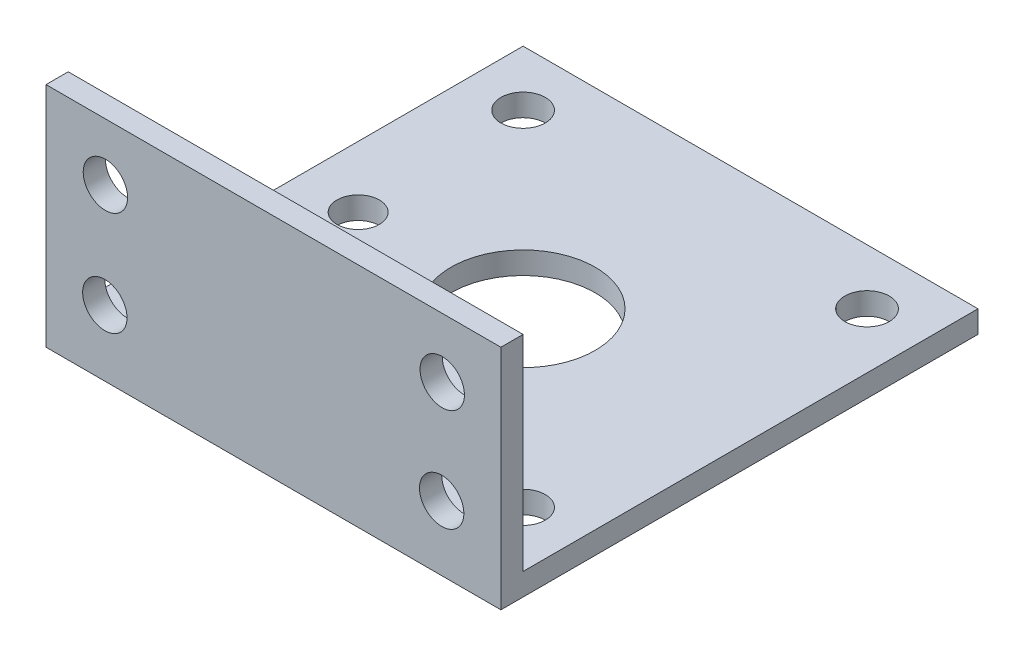
ISO-10303-21;
HEADER;
FILE_DESCRIPTION(('STEP AP214'),'2;1');
FILE_NAME('part.step','',(''),(''),'','','');
FILE_SCHEMA(('AUTOMOTIVE_DESIGN { 1 0 10303 214 1 1 1 1 }'));
ENDSEC;
DATA;
#1=APPLICATION_CONTEXT('core data for automotive mechanical design processes');
#2=APPLICATION_PROTOCOL_DEFINITION('international standard','automotive_design',2000,#1);
#3=PRODUCT_CONTEXT('',#1,'mechanical');
#4=PRODUCT('Part','Part','',(#3));
#5=PRODUCT_RELATED_PRODUCT_CATEGORY('part','',(#4));
#6=PRODUCT_DEFINITION_FORMATION('','',#4);
#7=PRODUCT_DEFINITION_CONTEXT('part definition',#1,'design');
#8=PRODUCT_DEFINITION('design','',#6,#7);
#9=PRODUCT_DEFINITION_SHAPE('','',#8);
#10=(LENGTH_UNIT() NAMED_UNIT(*) SI_UNIT(.MILLI.,.METRE.));
#11=(NAMED_UNIT(*) PLANE_ANGLE_UNIT() SI_UNIT($,.RADIAN.));
#12=(NAMED_UNIT(*) SI_UNIT($,.STERADIAN.) SOLID_ANGLE_UNIT());
#13=UNCERTAINTY_MEASURE_WITH_UNIT(LENGTH_MEASURE(1.E-05),#10,'distance_accuracy_value','');
#14=(GEOMETRIC_REPRESENTATION_CONTEXT(3) GLOBAL_UNCERTAINTY_ASSIGNED_CONTEXT((#13)) GLOBAL_UNIT_ASSIGNED_CONTEXT((#10,
#11,#12)) REPRESENTATION_CONTEXT('',''));
#15=CARTESIAN_POINT('',(0.,0.,0.));
#16=DIRECTION('',(0.,0.,1.));
#17=DIRECTION('',(1.,0.,0.));
#18=AXIS2_PLACEMENT_3D('',#15,#16,#17);
#19=CARTESIAN_POINT('',(0.,0.,22.5));
#20=DIRECTION('',(0.,0.,1.));
#21=DIRECTION('',(1.,0.,0.));
#22=AXIS2_PLACEMENT_3D('',#19,#20,#21);
#23=PLANE('',#22);
#24=CARTESIAN_POINT('',(15.2109088754108,15.1307672317759,22.5));
#25=DIRECTION('',(0.,0.,1.));
#26=DIRECTION('',(1.,0.,0.));
#27=AXIS2_PLACEMENT_3D('',#24,#25,#26);
#28=CIRCLE('',#27,2.);
#29=CARTESIAN_POINT('',(17.2109088754108,15.1307672317759,22.5));
#30=VERTEX_POINT('',#29);
#31=EDGE_CURVE('E224',#30,#30,#28,.F.);
#32=ORIENTED_EDGE('',*,*,#31,.T.);
#33=EDGE_LOOP('',(#32));
#34=FACE_BOUND('',#33,.T.);
#35=CARTESIAN_POINT('',(-15.1464761819282,15.3531982960748,22.5));
#36=DIRECTION('',(0.,0.,1.));
#37=DIRECTION('',(1.,0.,0.));
#38=AXIS2_PLACEMENT_3D('',#35,#36,#37);
#39=CIRCLE('',#38,2.);
#40=CARTESIAN_POINT('',(-13.1464761819282,15.3531982960748,22.5));
#41=VERTEX_POINT('',#40);
#42=EDGE_CURVE('E226',#41,#41,#39,.T.);
#43=ORIENTED_EDGE('',*,*,#42,.F.);
#44=EDGE_LOOP('',(#43));
#45=FACE_BOUND('',#44,.T.);
#46=CARTESIAN_POINT('',(15.1615117112667,5.8441003726651,22.5));
#47=DIRECTION('',(0.,0.,1.));
#48=DIRECTION('',(1.,0.,0.));
#49=AXIS2_PLACEMENT_3D('',#46,#47,#48);
#50=CIRCLE('',#49,2.);
#51=CARTESIAN_POINT('',(17.1615117112667,5.8441003726651,22.5));
#52=VERTEX_POINT('',#51);
#53=EDGE_CURVE('E229',#52,#52,#50,.T.);
#54=ORIENTED_EDGE('',*,*,#53,.F.);
#55=EDGE_LOOP('',(#54));
#56=FACE_BOUND('',#55,.T.);
#57=DIRECTION('',(1.,0.,0.));
#58=VECTOR('',#57,1.);
#59=CARTESIAN_POINT('',(0.,0.,22.5));
#60=LINE('',#59,#58);
#61=CARTESIAN_POINT('',(-20.5,0.,22.5));
#62=VERTEX_POINT('',#61);
#63=CARTESIAN_POINT('',(20.5,0.,22.5));
#64=VERTEX_POINT('',#63);
#65=EDGE_CURVE('E135',#62,#64,#60,.T.);
#66=ORIENTED_EDGE('',*,*,#65,.T.);
#67=DIRECTION('',(0.,1.,0.));
#68=VECTOR('',#67,1.);
#69=CARTESIAN_POINT('',(20.5,0.,22.5));
#70=LINE('',#69,#68);
#71=CARTESIAN_POINT('',(20.5,20.5,22.5));
#72=VERTEX_POINT('',#71);
#73=EDGE_CURVE('E140',#64,#72,#70,.T.);
#74=ORIENTED_EDGE('',*,*,#73,.T.);
#75=DIRECTION('',(1.,0.,0.));
#76=VECTOR('',#75,1.);
#77=CARTESIAN_POINT('',(0.,20.5,22.5));
#78=LINE('',#77,#76);
#79=CARTESIAN_POINT('',(-20.5,20.5,22.5));
#80=VERTEX_POINT('',#79);
#81=EDGE_CURVE('E147',#80,#72,#78,.T.);
#82=ORIENTED_EDGE('',*,*,#81,.F.);
#83=DIRECTION('',(0.,1.,0.));
#84=VECTOR('',#83,1.);
#85=CARTESIAN_POINT('',(-20.5,0.,22.5));
#86=LINE('',#85,#84);
#87=EDGE_CURVE('E144',#62,#80,#86,.T.);
#88=ORIENTED_EDGE('',*,*,#87,.F.);
#89=EDGE_LOOP('',(#66,#74,#82,#88));
#90=FACE_BOUND('',#89,.T.);
#91=CARTESIAN_POINT('',(-15.1965217916816,5.94462366240964,22.5));
#92=DIRECTION('',(0.,0.,1.));
#93=DIRECTION('',(1.,0.,0.));
#94=AXIS2_PLACEMENT_3D('',#91,#92,#93);
#95=CIRCLE('',#94,2.);
#96=CARTESIAN_POINT('',(-13.1965217916816,5.94462366240964,22.5));
#97=VERTEX_POINT('',#96);
#98=EDGE_CURVE('E157',#97,#97,#95,.F.);
#99=ORIENTED_EDGE('',*,*,#98,.T.);
#100=EDGE_LOOP('',(#99));
#101=FACE_BOUND('',#100,.T.);
#102=ADVANCED_FACE('F35',(#34,#45,#56,#90,#101),#23,.T.);
#103=CARTESIAN_POINT('',(0.,0.,20.5));
#104=DIRECTION('',(0.,0.,1.));
#105=DIRECTION('',(1.,0.,0.));
#106=AXIS2_PLACEMENT_3D('',#103,#104,#105);
#107=PLANE('',#106);
#108=CARTESIAN_POINT('',(-15.1464761819282,15.3531982960748,20.5));
#109=DIRECTION('',(0.,0.,-1.));
#110=DIRECTION('',(-1.,0.,0.));
#111=AXIS2_PLACEMENT_3D('',#108,#109,#110);
#112=CIRCLE('',#111,2.);
#113=CARTESIAN_POINT('',(-17.1464761819282,15.3531982960748,20.5));
#114=VERTEX_POINT('',#113);
#115=EDGE_CURVE('E235',#114,#114,#112,.T.);
#116=ORIENTED_EDGE('',*,*,#115,.F.);
#117=EDGE_LOOP('',(#116));
#118=FACE_BOUND('',#117,.T.);
#119=CARTESIAN_POINT('',(15.1615117112667,5.8441003726651,20.5));
#120=DIRECTION('',(0.,0.,-1.));
#121=DIRECTION('',(-1.,0.,0.));
#122=AXIS2_PLACEMENT_3D('',#119,#120,#121);
#123=CIRCLE('',#122,2.);
#124=CARTESIAN_POINT('',(13.1615117112667,5.8441003726651,20.5));
#125=VERTEX_POINT('',#124);
#126=EDGE_CURVE('E232',#125,#125,#123,.T.);
#127=ORIENTED_EDGE('',*,*,#126,.F.);
#128=EDGE_LOOP('',(#127));
#129=FACE_BOUND('',#128,.T.);
#130=DIRECTION('',(1.,0.,0.));
#131=VECTOR('',#130,1.);
#132=CARTESIAN_POINT('',(0.,2.,20.5));
#133=LINE('',#132,#131);
#134=CARTESIAN_POINT('',(-20.5,2.,20.5));
#135=VERTEX_POINT('',#134);
#136=CARTESIAN_POINT('',(20.5,2.,20.5));
#137=VERTEX_POINT('',#136);
#138=EDGE_CURVE('E69',#135,#137,#133,.T.);
#139=ORIENTED_EDGE('',*,*,#138,.F.);
#140=DIRECTION('',(0.,1.,0.));
#141=VECTOR('',#140,1.);
#142=CARTESIAN_POINT('',(-20.5,0.,20.5));
#143=LINE('',#142,#141);
#144=CARTESIAN_POINT('',(-20.5,20.5,20.5));
#145=VERTEX_POINT('',#144);
#146=EDGE_CURVE('E141',#135,#145,#143,.T.);
#147=ORIENTED_EDGE('',*,*,#146,.T.);
#148=DIRECTION('',(1.,0.,0.));
#149=VECTOR('',#148,1.);
#150=CARTESIAN_POINT('',(0.,20.5,20.5));
#151=LINE('',#150,#149);
#152=CARTESIAN_POINT('',(20.5,20.5,20.5));
#153=VERTEX_POINT('',#152);
#154=EDGE_CURVE('E156',#145,#153,#151,.T.);
#155=ORIENTED_EDGE('',*,*,#154,.T.);
#156=DIRECTION('',(0.,1.,0.));
#157=VECTOR('',#156,1.);
#158=CARTESIAN_POINT('',(20.5,0.,20.5));
#159=LINE('',#158,#157);
#160=EDGE_CURVE('E52',#137,#153,#159,.T.);
#161=ORIENTED_EDGE('',*,*,#160,.F.);
#162=EDGE_LOOP('',(#139,#147,#155,#161));
#163=FACE_BOUND('',#162,.T.);
#164=CARTESIAN_POINT('',(15.2109088754108,15.1307672317759,20.5));
#165=DIRECTION('',(0.,0.,1.));
#166=DIRECTION('',(1.,0.,0.));
#167=AXIS2_PLACEMENT_3D('',#164,#165,#166);
#168=CIRCLE('',#167,2.);
#169=CARTESIAN_POINT('',(17.2109088754108,15.1307672317759,20.5));
#170=VERTEX_POINT('',#169);
#171=EDGE_CURVE('E239',#170,#170,#168,.T.);
#172=ORIENTED_EDGE('',*,*,#171,.T.);
#173=EDGE_LOOP('',(#172));
#174=FACE_BOUND('',#173,.T.);
#175=CARTESIAN_POINT('',(-15.1965217916816,5.94462366240964,20.5));
#176=DIRECTION('',(0.,0.,1.));
#177=DIRECTION('',(1.,0.,0.));
#178=AXIS2_PLACEMENT_3D('',#175,#176,#177);
#179=CIRCLE('',#178,2.);
#180=CARTESIAN_POINT('',(-13.1965217916816,5.94462366240964,20.5));
#181=VERTEX_POINT('',#180);
#182=EDGE_CURVE('E236',#181,#181,#179,.T.);
#183=ORIENTED_EDGE('',*,*,#182,.T.);
#184=EDGE_LOOP('',(#183));
#185=FACE_BOUND('',#184,.T.);
#186=ADVANCED_FACE('F192',(#118,#129,#163,#174,#185),#107,.F.);
#187=CARTESIAN_POINT('',(20.5,2.,0.));
#188=DIRECTION('',(1.,0.,0.));
#189=DIRECTION('',(0.,0.,-1.));
#190=AXIS2_PLACEMENT_3D('',#187,#188,#189);
#191=PLANE('',#190);
#192=DIRECTION('',(0.,0.,1.));
#193=VECTOR('',#192,1.);
#194=CARTESIAN_POINT('',(20.5,0.,0.));
#195=LINE('',#194,#193);
#196=CARTESIAN_POINT('',(20.5,0.,-20.5));
#197=VERTEX_POINT('',#196);
#198=EDGE_CURVE('E84',#197,#64,#195,.T.);
#199=ORIENTED_EDGE('',*,*,#198,.F.);
#200=DIRECTION('',(0.,-1.,0.));
#201=VECTOR('',#200,1.);
#202=CARTESIAN_POINT('',(20.5,2.,-20.5));
#203=LINE('',#202,#201);
#204=CARTESIAN_POINT('',(20.5,2.,-20.5));
#205=VERTEX_POINT('',#204);
#206=EDGE_CURVE('E11',#205,#197,#203,.T.);
#207=ORIENTED_EDGE('',*,*,#206,.F.);
#208=DIRECTION('',(0.,0.,1.));
#209=VECTOR('',#208,1.);
#210=CARTESIAN_POINT('',(20.5,2.,0.));
#211=LINE('',#210,#209);
#212=EDGE_CURVE('E81',#205,#137,#211,.T.);
#213=ORIENTED_EDGE('',*,*,#212,.T.);
#214=ORIENTED_EDGE('',*,*,#160,.T.);
#215=DIRECTION('',(0.,0.,-1.));
#216=VECTOR('',#215,1.);
#217=CARTESIAN_POINT('',(20.5,20.5,22.5));
#218=LINE('',#217,#216);
#219=EDGE_CURVE('E109',#72,#153,#218,.T.);
#220=ORIENTED_EDGE('',*,*,#219,.F.);
#221=ORIENTED_EDGE('',*,*,#73,.F.);
#222=EDGE_LOOP('',(#199,#207,#213,#214,#220,#221));
#223=FACE_BOUND('',#222,.T.);
#224=ADVANCED_FACE('F80',(#223),#191,.T.);
#225=CARTESIAN_POINT('',(0.,2.,-20.5));
#226=DIRECTION('',(0.,0.,-1.));
#227=DIRECTION('',(-1.,0.,0.));
#228=AXIS2_PLACEMENT_3D('',#225,#226,#227);
#229=PLANE('',#228);
#230=DIRECTION('',(1.,0.,0.));
#231=VECTOR('',#230,1.);
#232=CARTESIAN_POINT('',(0.,0.,-20.5));
#233=LINE('',#232,#231);
#234=CARTESIAN_POINT('',(-20.5,0.,-20.5));
#235=VERTEX_POINT('',#234);
#236=EDGE_CURVE('E119',#235,#197,#233,.T.);
#237=ORIENTED_EDGE('',*,*,#236,.F.);
#238=DIRECTION('',(0.,-1.,0.));
#239=VECTOR('',#238,1.);
#240=CARTESIAN_POINT('',(-20.5,2.,-20.5));
#241=LINE('',#240,#239);
#242=CARTESIAN_POINT('',(-20.5,2.,-20.5));
#243=VERTEX_POINT('',#242);
#244=EDGE_CURVE('E44',#243,#235,#241,.T.);
#245=ORIENTED_EDGE('',*,*,#244,.F.);
#246=DIRECTION('',(1.,0.,0.));
#247=VECTOR('',#246,1.);
#248=CARTESIAN_POINT('',(0.,2.,-20.5));
#249=LINE('',#248,#247);
#250=EDGE_CURVE('E91',#243,#205,#249,.T.);
#251=ORIENTED_EDGE('',*,*,#250,.T.);
#252=ORIENTED_EDGE('',*,*,#206,.T.);
#253=EDGE_LOOP('',(#237,#245,#251,#252));
#254=FACE_BOUND('',#253,.T.);
#255=ADVANCED_FACE('F94',(#254),#229,.T.);
#256=CARTESIAN_POINT('',(-20.5,2.,0.));
#257=DIRECTION('',(1.,0.,0.));
#258=DIRECTION('',(0.,0.,-1.));
#259=AXIS2_PLACEMENT_3D('',#256,#257,#258);
#260=PLANE('',#259);
#261=DIRECTION('',(0.,0.,1.));
#262=VECTOR('',#261,1.);
#263=CARTESIAN_POINT('',(-20.5,0.,0.));
#264=LINE('',#263,#262);
#265=EDGE_CURVE('E121',#235,#62,#264,.T.);
#266=ORIENTED_EDGE('',*,*,#265,.T.);
#267=ORIENTED_EDGE('',*,*,#87,.T.);
#268=DIRECTION('',(0.,0.,-1.));
#269=VECTOR('',#268,1.);
#270=CARTESIAN_POINT('',(-20.5,20.5,22.5));
#271=LINE('',#270,#269);
#272=EDGE_CURVE('E149',#80,#145,#271,.T.);
#273=ORIENTED_EDGE('',*,*,#272,.T.);
#274=ORIENTED_EDGE('',*,*,#146,.F.);
#275=DIRECTION('',(0.,0.,1.));
#276=VECTOR('',#275,1.);
#277=CARTESIAN_POINT('',(-20.5,2.,0.));
#278=LINE('',#277,#276);
#279=EDGE_CURVE('E96',#243,#135,#278,.T.);
#280=ORIENTED_EDGE('',*,*,#279,.F.);
#281=ORIENTED_EDGE('',*,*,#244,.T.);
#282=EDGE_LOOP('',(#266,#267,#273,#274,#280,#281));
#283=FACE_BOUND('',#282,.T.);
#284=ADVANCED_FACE('F128',(#283),#260,.F.);
#285=CARTESIAN_POINT('',(0.,2.,0.));
#286=DIRECTION('',(0.,-1.,0.));
#287=DIRECTION('',(0.,0.,-1.));
#288=AXIS2_PLACEMENT_3D('',#285,#286,#287);
#289=CYLINDRICAL_SURFACE('',#288,6.5);
#290=CARTESIAN_POINT('',(0.,2.,0.));
#291=DIRECTION('',(0.,1.,0.));
#292=DIRECTION('',(0.,0.,1.));
#293=AXIS2_PLACEMENT_3D('',#290,#291,#292);
#294=CIRCLE('',#293,6.5);
#295=CARTESIAN_POINT('',(0.,2.,6.5));
#296=VERTEX_POINT('',#295);
#297=EDGE_CURVE('E92',#296,#296,#294,.T.);
#298=ORIENTED_EDGE('',*,*,#297,.T.);
#299=EDGE_LOOP('',(#298));
#300=FACE_BOUND('',#299,.T.);
#301=CARTESIAN_POINT('',(0.,0.,0.));
#302=DIRECTION('',(0.,1.,0.));
#303=DIRECTION('',(0.,0.,1.));
#304=AXIS2_PLACEMENT_3D('',#301,#302,#303);
#305=CIRCLE('',#304,6.5);
#306=CARTESIAN_POINT('',(0.,0.,6.5));
#307=VERTEX_POINT('',#306);
#308=EDGE_CURVE('E115',#307,#307,#305,.T.);
#309=ORIENTED_EDGE('',*,*,#308,.F.);
#310=EDGE_LOOP('',(#309));
#311=FACE_BOUND('',#310,.T.);
#312=ADVANCED_FACE('F172',(#300,#311),#289,.F.);
#313=CARTESIAN_POINT('',(15.5,2.,-15.5));
#314=DIRECTION('',(0.,-1.,0.));
#315=DIRECTION('',(0.,0.,-1.));
#316=AXIS2_PLACEMENT_3D('',#313,#314,#315);
#317=CYLINDRICAL_SURFACE('',#316,2.);
#318=CARTESIAN_POINT('',(15.5,2.,-15.5));
#319=DIRECTION('',(0.,1.,0.));
#320=DIRECTION('',(0.,0.,1.));
#321=AXIS2_PLACEMENT_3D('',#318,#319,#320);
#322=CIRCLE('',#321,2.);
#323=CARTESIAN_POINT('',(15.5,2.,-13.5));
#324=VERTEX_POINT('',#323);
#325=EDGE_CURVE('E167',#324,#324,#322,.T.);
#326=ORIENTED_EDGE('',*,*,#325,.T.);
#327=EDGE_LOOP('',(#326));
#328=FACE_BOUND('',#327,.T.);
#329=CARTESIAN_POINT('',(15.5,0.,-15.5));
#330=DIRECTION('',(0.,1.,0.));
#331=DIRECTION('',(0.,0.,1.));
#332=AXIS2_PLACEMENT_3D('',#329,#330,#331);
#333=CIRCLE('',#332,2.);
#334=CARTESIAN_POINT('',(15.5,0.,-13.5));
#335=VERTEX_POINT('',#334);
#336=EDGE_CURVE('E112',#335,#335,#333,.T.);
#337=ORIENTED_EDGE('',*,*,#336,.F.);
#338=EDGE_LOOP('',(#337));
#339=FACE_BOUND('',#338,.T.);
#340=ADVANCED_FACE('F261',(#328,#339),#317,.F.);
#341=CARTESIAN_POINT('',(-15.5,2.,-15.5));
#342=DIRECTION('',(0.,-1.,0.));
#343=DIRECTION('',(0.,0.,-1.));
#344=AXIS2_PLACEMENT_3D('',#341,#342,#343);
#345=CYLINDRICAL_SURFACE('',#344,2.);
#346=CARTESIAN_POINT('',(-15.5,2.,-15.5));
#347=DIRECTION('',(0.,1.,0.));
#348=DIRECTION('',(0.,0.,1.));
#349=AXIS2_PLACEMENT_3D('',#346,#347,#348);
#350=CIRCLE('',#349,2.);
#351=CARTESIAN_POINT('',(-15.5,2.,-13.5));
#352=VERTEX_POINT('',#351);
#353=EDGE_CURVE('E164',#352,#352,#350,.F.);
#354=ORIENTED_EDGE('',*,*,#353,.F.);
#355=EDGE_LOOP('',(#354));
#356=FACE_BOUND('',#355,.T.);
#357=CARTESIAN_POINT('',(-15.5,0.,-15.5));
#358=DIRECTION('',(0.,1.,0.));
#359=DIRECTION('',(0.,0.,1.));
#360=AXIS2_PLACEMENT_3D('',#357,#358,#359);
#361=CIRCLE('',#360,2.);
#362=CARTESIAN_POINT('',(-15.5,0.,-13.5));
#363=VERTEX_POINT('',#362);
#364=EDGE_CURVE('E108',#363,#363,#361,.F.);
#365=ORIENTED_EDGE('',*,*,#364,.T.);
#366=EDGE_LOOP('',(#365));
#367=FACE_BOUND('',#366,.T.);
#368=ADVANCED_FACE('F267',(#356,#367),#345,.F.);
#369=CARTESIAN_POINT('',(-15.5,2.,15.5));
#370=DIRECTION('',(0.,-1.,0.));
#371=DIRECTION('',(0.,0.,-1.));
#372=AXIS2_PLACEMENT_3D('',#369,#370,#371);
#373=CYLINDRICAL_SURFACE('',#372,2.);
#374=CARTESIAN_POINT('',(-15.5,2.,15.5));
#375=DIRECTION('',(0.,1.,0.));
#376=DIRECTION('',(0.,0.,1.));
#377=AXIS2_PLACEMENT_3D('',#374,#375,#376);
#378=CIRCLE('',#377,2.);
#379=CARTESIAN_POINT('',(-15.5,2.,17.5));
#380=VERTEX_POINT('',#379);
#381=EDGE_CURVE('E125',#380,#380,#378,.T.);
#382=ORIENTED_EDGE('',*,*,#381,.T.);
#383=EDGE_LOOP('',(#382));
#384=FACE_BOUND('',#383,.T.);
#385=CARTESIAN_POINT('',(-15.5,0.,15.5));
#386=DIRECTION('',(0.,1.,0.));
#387=DIRECTION('',(0.,0.,1.));
#388=AXIS2_PLACEMENT_3D('',#385,#386,#387);
#389=CIRCLE('',#388,2.);
#390=CARTESIAN_POINT('',(-15.5,0.,17.5));
#391=VERTEX_POINT('',#390);
#392=EDGE_CURVE('E105',#391,#391,#389,.T.);
#393=ORIENTED_EDGE('',*,*,#392,.F.);
#394=EDGE_LOOP('',(#393));
#395=FACE_BOUND('',#394,.T.);
#396=ADVANCED_FACE('F37',(#384,#395),#373,.F.);
#397=CARTESIAN_POINT('',(15.5,2.,15.5));
#398=DIRECTION('',(0.,-1.,0.));
#399=DIRECTION('',(0.,0.,-1.));
#400=AXIS2_PLACEMENT_3D('',#397,#398,#399);
#401=CYLINDRICAL_SURFACE('',#400,2.);
#402=CARTESIAN_POINT('',(15.5,2.,15.5));
#403=DIRECTION('',(0.,1.,0.));
#404=DIRECTION('',(0.,0.,1.));
#405=AXIS2_PLACEMENT_3D('',#402,#403,#404);
#406=CIRCLE('',#405,2.);
#407=CARTESIAN_POINT('',(15.5,2.,17.5));
#408=VERTEX_POINT('',#407);
#409=EDGE_CURVE('E102',#408,#408,#406,.F.);
#410=ORIENTED_EDGE('',*,*,#409,.F.);
#411=EDGE_LOOP('',(#410));
#412=FACE_BOUND('',#411,.T.);
#413=CARTESIAN_POINT('',(15.5,0.,15.5));
#414=DIRECTION('',(0.,1.,0.));
#415=DIRECTION('',(0.,0.,1.));
#416=AXIS2_PLACEMENT_3D('',#413,#414,#415);
#417=CIRCLE('',#416,2.);
#418=CARTESIAN_POINT('',(15.5,0.,17.5));
#419=VERTEX_POINT('',#418);
#420=EDGE_CURVE('E123',#419,#419,#417,.F.);
#421=ORIENTED_EDGE('',*,*,#420,.T.);
#422=EDGE_LOOP('',(#421));
#423=FACE_BOUND('',#422,.T.);
#424=ADVANCED_FACE('F176',(#412,#423),#401,.F.);
#425=CARTESIAN_POINT('',(0.,2.,0.));
#426=DIRECTION('',(0.,1.,0.));
#427=DIRECTION('',(0.,0.,1.));
#428=AXIS2_PLACEMENT_3D('',#425,#426,#427);
#429=PLANE('',#428);
#430=CARTESIAN_POINT('',(-14.9734473891045,2.,-0.105568022853115));
#431=DIRECTION('',(0.,1.,0.));
#432=DIRECTION('',(0.,0.,1.));
#433=AXIS2_PLACEMENT_3D('',#430,#431,#432);
#434=CIRCLE('',#433,1.91139756625913);
#435=CARTESIAN_POINT('',(-14.9734473891045,2.,1.80582954340601));
#436=VERTEX_POINT('',#435);
#437=EDGE_CURVE('E240',#436,#436,#434,.T.);
#438=ORIENTED_EDGE('',*,*,#437,.F.);
#439=EDGE_LOOP('',(#438));
#440=FACE_BOUND('',#439,.T.);
#441=ORIENTED_EDGE('',*,*,#381,.F.);
#442=EDGE_LOOP('',(#441));
#443=FACE_BOUND('',#442,.T.);
#444=ORIENTED_EDGE('',*,*,#353,.T.);
#445=EDGE_LOOP('',(#444));
#446=FACE_BOUND('',#445,.T.);
#447=ORIENTED_EDGE('',*,*,#325,.F.);
#448=EDGE_LOOP('',(#447));
#449=FACE_BOUND('',#448,.T.);
#450=ORIENTED_EDGE('',*,*,#297,.F.);
#451=EDGE_LOOP('',(#450));
#452=FACE_BOUND('',#451,.T.);
#453=ORIENTED_EDGE('',*,*,#212,.F.);
#454=ORIENTED_EDGE('',*,*,#250,.F.);
#455=ORIENTED_EDGE('',*,*,#279,.T.);
#456=ORIENTED_EDGE('',*,*,#138,.T.);
#457=EDGE_LOOP('',(#453,#454,#455,#456));
#458=FACE_BOUND('',#457,.T.);
#459=ORIENTED_EDGE('',*,*,#409,.T.);
#460=EDGE_LOOP('',(#459));
#461=FACE_BOUND('',#460,.T.);
#462=ADVANCED_FACE('F88',(#440,#443,#446,#449,#452,#458,#461),#429,.T.);
#463=CARTESIAN_POINT('',(0.,0.,0.));
#464=DIRECTION('',(0.,1.,0.));
#465=DIRECTION('',(0.,0.,1.));
#466=AXIS2_PLACEMENT_3D('',#463,#464,#465);
#467=PLANE('',#466);
#468=CARTESIAN_POINT('',(-14.9734473891045,0.,-0.105568022853115));
#469=DIRECTION('',(0.,-1.,0.));
#470=DIRECTION('',(0.,0.,-1.));
#471=AXIS2_PLACEMENT_3D('',#468,#469,#470);
#472=CIRCLE('',#471,1.91139756625913);
#473=CARTESIAN_POINT('',(-14.9734473891045,0.,-2.01696558911224));
#474=VERTEX_POINT('',#473);
#475=EDGE_CURVE('E247',#474,#474,#472,.T.);
#476=ORIENTED_EDGE('',*,*,#475,.F.);
#477=EDGE_LOOP('',(#476));
#478=FACE_BOUND('',#477,.T.);
#479=ORIENTED_EDGE('',*,*,#392,.T.);
#480=EDGE_LOOP('',(#479));
#481=FACE_BOUND('',#480,.T.);
#482=ORIENTED_EDGE('',*,*,#364,.F.);
#483=EDGE_LOOP('',(#482));
#484=FACE_BOUND('',#483,.T.);
#485=ORIENTED_EDGE('',*,*,#336,.T.);
#486=EDGE_LOOP('',(#485));
#487=FACE_BOUND('',#486,.T.);
#488=ORIENTED_EDGE('',*,*,#308,.T.);
#489=EDGE_LOOP('',(#488));
#490=FACE_BOUND('',#489,.T.);
#491=ORIENTED_EDGE('',*,*,#198,.T.);
#492=ORIENTED_EDGE('',*,*,#65,.F.);
#493=ORIENTED_EDGE('',*,*,#265,.F.);
#494=ORIENTED_EDGE('',*,*,#236,.T.);
#495=EDGE_LOOP('',(#491,#492,#493,#494));
#496=FACE_BOUND('',#495,.T.);
#497=ORIENTED_EDGE('',*,*,#420,.F.);
#498=EDGE_LOOP('',(#497));
#499=FACE_BOUND('',#498,.T.);
#500=ADVANCED_FACE('F132',(#478,#481,#484,#487,#490,#496,#499),#467,.F.);
#501=CARTESIAN_POINT('',(0.,20.5,22.5));
#502=DIRECTION('',(0.,1.,0.));
#503=DIRECTION('',(0.,0.,1.));
#504=AXIS2_PLACEMENT_3D('',#501,#502,#503);
#505=PLANE('',#504);
#506=ORIENTED_EDGE('',*,*,#154,.F.);
#507=ORIENTED_EDGE('',*,*,#272,.F.);
#508=ORIENTED_EDGE('',*,*,#81,.T.);
#509=ORIENTED_EDGE('',*,*,#219,.T.);
#510=EDGE_LOOP('',(#506,#507,#508,#509));
#511=FACE_BOUND('',#510,.T.);
#512=ADVANCED_FACE('F183',(#511),#505,.T.);
#513=CARTESIAN_POINT('',(15.1615117112667,5.8441003726651,30.5));
#514=DIRECTION('',(0.,0.,-1.));
#515=DIRECTION('',(-1.,0.,0.));
#516=AXIS2_PLACEMENT_3D('',#513,#514,#515);
#517=CYLINDRICAL_SURFACE('',#516,2.);
#518=ORIENTED_EDGE('',*,*,#53,.T.);
#519=EDGE_LOOP('',(#518));
#520=FACE_BOUND('',#519,.T.);
#521=ORIENTED_EDGE('',*,*,#126,.T.);
#522=EDGE_LOOP('',(#521));
#523=FACE_BOUND('',#522,.T.);
#524=ADVANCED_FACE('F203',(#520,#523),#517,.F.);
#525=CARTESIAN_POINT('',(-15.1464761819282,15.3531982960748,30.5));
#526=DIRECTION('',(0.,0.,-1.));
#527=DIRECTION('',(-1.,0.,0.));
#528=AXIS2_PLACEMENT_3D('',#525,#526,#527);
#529=CYLINDRICAL_SURFACE('',#528,2.);
#530=ORIENTED_EDGE('',*,*,#42,.T.);
#531=EDGE_LOOP('',(#530));
#532=FACE_BOUND('',#531,.T.);
#533=ORIENTED_EDGE('',*,*,#115,.T.);
#534=EDGE_LOOP('',(#533));
#535=FACE_BOUND('',#534,.T.);
#536=ADVANCED_FACE('F210',(#532,#535),#529,.F.);
#537=CARTESIAN_POINT('',(15.2109088754108,15.1307672317759,30.5));
#538=DIRECTION('',(0.,0.,-1.));
#539=DIRECTION('',(-1.,0.,0.));
#540=AXIS2_PLACEMENT_3D('',#537,#538,#539);
#541=CYLINDRICAL_SURFACE('',#540,2.);
#542=ORIENTED_EDGE('',*,*,#31,.F.);
#543=EDGE_LOOP('',(#542));
#544=FACE_BOUND('',#543,.T.);
#545=ORIENTED_EDGE('',*,*,#171,.F.);
#546=EDGE_LOOP('',(#545));
#547=FACE_BOUND('',#546,.T.);
#548=ADVANCED_FACE('F341',(#544,#547),#541,.F.);
#549=CARTESIAN_POINT('',(-15.1965217916816,5.94462366240964,30.5));
#550=DIRECTION('',(0.,0.,-1.));
#551=DIRECTION('',(-1.,0.,0.));
#552=AXIS2_PLACEMENT_3D('',#549,#550,#551);
#553=CYLINDRICAL_SURFACE('',#552,2.);
#554=ORIENTED_EDGE('',*,*,#98,.F.);
#555=EDGE_LOOP('',(#554));
#556=FACE_BOUND('',#555,.T.);
#557=ORIENTED_EDGE('',*,*,#182,.F.);
#558=EDGE_LOOP('',(#557));
#559=FACE_BOUND('',#558,.T.);
#560=ADVANCED_FACE('F351',(#556,#559),#553,.F.);
#561=CARTESIAN_POINT('',(-14.9734473891045,10.,-0.105568022853115));
#562=DIRECTION('',(0.,-1.,0.));
#563=DIRECTION('',(0.,0.,-1.));
#564=AXIS2_PLACEMENT_3D('',#561,#562,#563);
#565=CYLINDRICAL_SURFACE('',#564,1.91139756625913);
#566=ORIENTED_EDGE('',*,*,#437,.T.);
#567=EDGE_LOOP('',(#566));
#568=FACE_BOUND('',#567,.T.);
#569=ORIENTED_EDGE('',*,*,#475,.T.);
#570=EDGE_LOOP('',(#569));
#571=FACE_BOUND('',#570,.T.);
#572=ADVANCED_FACE('F251',(#568,#571),#565,.F.);
#573=CLOSED_SHELL('',(#102,#186,#224,#255,#284,#312,#340,#368,#396,#424,#462,#500,#512,#524,
#536,#548,#560,#572));
#574=MANIFOLD_SOLID_BREP('B2',#573);
#575=ADVANCED_BREP_SHAPE_REPRESENTATION('',(#18,#574),#14);
#576=SHAPE_DEFINITION_REPRESENTATION(#9,#575);
ENDSEC;
END-ISO-10303-21;
